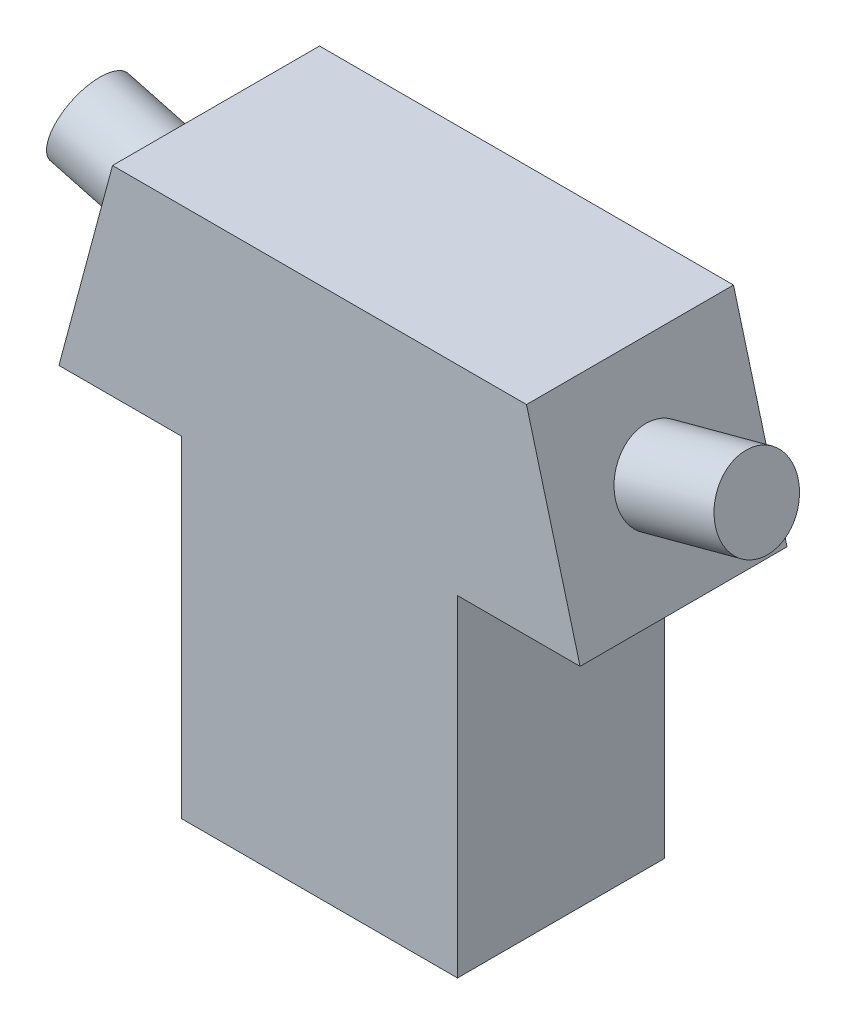
ISO-10303-21;
HEADER;
FILE_DESCRIPTION(('STEP AP214'),'2;1');
FILE_NAME('part.step','',(''),(''),'','','');
FILE_SCHEMA(('AUTOMOTIVE_DESIGN { 1 0 10303 214 1 1 1 1 }'));
ENDSEC;
DATA;
#1=APPLICATION_CONTEXT('core data for automotive mechanical design processes');
#2=APPLICATION_PROTOCOL_DEFINITION('international standard','automotive_design',2000,#1);
#3=PRODUCT_CONTEXT('',#1,'mechanical');
#4=PRODUCT('Part','Part','',(#3));
#5=PRODUCT_RELATED_PRODUCT_CATEGORY('part','',(#4));
#6=PRODUCT_DEFINITION_FORMATION('','',#4);
#7=PRODUCT_DEFINITION_CONTEXT('part definition',#1,'design');
#8=PRODUCT_DEFINITION('design','',#6,#7);
#9=PRODUCT_DEFINITION_SHAPE('','',#8);
#10=(LENGTH_UNIT() NAMED_UNIT(*) SI_UNIT(.MILLI.,.METRE.));
#11=(NAMED_UNIT(*) PLANE_ANGLE_UNIT() SI_UNIT($,.RADIAN.));
#12=(NAMED_UNIT(*) SI_UNIT($,.STERADIAN.) SOLID_ANGLE_UNIT());
#13=UNCERTAINTY_MEASURE_WITH_UNIT(LENGTH_MEASURE(1.E-05),#10,'distance_accuracy_value','');
#14=(GEOMETRIC_REPRESENTATION_CONTEXT(3) GLOBAL_UNCERTAINTY_ASSIGNED_CONTEXT((#13)) GLOBAL_UNIT_ASSIGNED_CONTEXT((#10,
#11,#12)) REPRESENTATION_CONTEXT('',''));
#15=CARTESIAN_POINT('',(0.,0.,0.));
#16=DIRECTION('',(0.,0.,1.));
#17=DIRECTION('',(1.,0.,0.));
#18=AXIS2_PLACEMENT_3D('',#15,#16,#17);
#19=CARTESIAN_POINT('',(100.,0.,150.));
#20=DIRECTION('',(-1.,0.,0.));
#21=DIRECTION('',(0.,0.,1.));
#22=AXIS2_PLACEMENT_3D('',#19,#20,#21);
#23=PLANE('',#22);
#24=DIRECTION('',(0.,1.,0.));
#25=VECTOR('',#24,1.);
#26=CARTESIAN_POINT('',(100.,0.,0.));
#27=LINE('',#26,#25);
#28=CARTESIAN_POINT('',(100.,0.,0.));
#29=VERTEX_POINT('',#28);
#30=CARTESIAN_POINT('',(100.,240.,0.));
#31=VERTEX_POINT('',#30);
#32=EDGE_CURVE('E133',#29,#31,#27,.T.);
#33=ORIENTED_EDGE('',*,*,#32,.T.);
#34=DIRECTION('',(0.,0.,-1.));
#35=VECTOR('',#34,1.);
#36=CARTESIAN_POINT('',(100.,240.,150.));
#37=LINE('',#36,#35);
#38=CARTESIAN_POINT('',(100.,240.,150.));
#39=VERTEX_POINT('',#38);
#40=EDGE_CURVE('E38',#39,#31,#37,.T.);
#41=ORIENTED_EDGE('',*,*,#40,.F.);
#42=DIRECTION('',(0.,1.,0.));
#43=VECTOR('',#42,1.);
#44=CARTESIAN_POINT('',(100.,0.,150.));
#45=LINE('',#44,#43);
#46=CARTESIAN_POINT('',(100.,0.,150.));
#47=VERTEX_POINT('',#46);
#48=EDGE_CURVE('E148',#47,#39,#45,.T.);
#49=ORIENTED_EDGE('',*,*,#48,.F.);
#50=DIRECTION('',(0.,0.,-1.));
#51=VECTOR('',#50,1.);
#52=CARTESIAN_POINT('',(100.,0.,150.));
#53=LINE('',#52,#51);
#54=EDGE_CURVE('E129',#47,#29,#53,.T.);
#55=ORIENTED_EDGE('',*,*,#54,.T.);
#56=EDGE_LOOP('',(#33,#41,#49,#55));
#57=FACE_BOUND('',#56,.T.);
#58=ADVANCED_FACE('F35',(#57),#23,.F.);
#59=CARTESIAN_POINT('',(100.,240.,150.));
#60=DIRECTION('',(0.,1.,0.));
#61=DIRECTION('',(0.,0.,1.));
#62=AXIS2_PLACEMENT_3D('',#59,#60,#61);
#63=PLANE('',#62);
#64=DIRECTION('',(1.,0.,0.));
#65=VECTOR('',#64,1.);
#66=CARTESIAN_POINT('',(100.,240.,0.));
#67=LINE('',#66,#65);
#68=CARTESIAN_POINT('',(188.822856765379,240.,0.));
#69=VERTEX_POINT('',#68);
#70=EDGE_CURVE('E136',#31,#69,#67,.T.);
#71=ORIENTED_EDGE('',*,*,#70,.T.);
#72=DIRECTION('',(0.,0.,-1.));
#73=VECTOR('',#72,1.);
#74=CARTESIAN_POINT('',(188.822856765379,240.,150.));
#75=LINE('',#74,#73);
#76=CARTESIAN_POINT('',(188.822856765379,240.,150.));
#77=VERTEX_POINT('',#76);
#78=EDGE_CURVE('E157',#77,#69,#75,.T.);
#79=ORIENTED_EDGE('',*,*,#78,.F.);
#80=DIRECTION('',(1.,0.,0.));
#81=VECTOR('',#80,1.);
#82=CARTESIAN_POINT('',(100.,240.,150.));
#83=LINE('',#82,#81);
#84=EDGE_CURVE('E96',#39,#77,#83,.T.);
#85=ORIENTED_EDGE('',*,*,#84,.F.);
#86=ORIENTED_EDGE('',*,*,#40,.T.);
#87=EDGE_LOOP('',(#71,#79,#85,#86));
#88=FACE_BOUND('',#87,.T.);
#89=ADVANCED_FACE('F163',(#88),#63,.F.);
#90=CARTESIAN_POINT('',(188.822856765379,240.,150.));
#91=DIRECTION('',(-0.965925826289067,-0.258819045102525,0.));
#92=DIRECTION('',(0.258819045102525,-0.965925826289067,0.));
#93=AXIS2_PLACEMENT_3D('',#90,#91,#92);
#94=PLANE('',#93);
#95=CARTESIAN_POINT('',(169.411428382689,312.44443697168,75.));
#96=DIRECTION('',(0.965925826289067,0.258819045102525,0.));
#97=DIRECTION('',(-0.258819045102525,0.965925826289067,0.));
#98=AXIS2_PLACEMENT_3D('',#95,#96,#97);
#99=CIRCLE('',#98,30.);
#100=CARTESIAN_POINT('',(161.646857029614,341.422211760352,75.));
#101=VERTEX_POINT('',#100);
#102=EDGE_CURVE('E11',#101,#101,#99,.T.);
#103=ORIENTED_EDGE('',*,*,#102,.F.);
#104=EDGE_LOOP('',(#103));
#105=FACE_BOUND('',#104,.T.);
#106=DIRECTION('',(-0.258819045102525,0.965925826289067,0.));
#107=VECTOR('',#106,1.);
#108=CARTESIAN_POINT('',(188.822856765379,240.,0.));
#109=LINE('',#108,#107);
#110=CARTESIAN_POINT('',(150.,384.88887394336,0.));
#111=VERTEX_POINT('',#110);
#112=EDGE_CURVE('E139',#69,#111,#109,.T.);
#113=ORIENTED_EDGE('',*,*,#112,.T.);
#114=DIRECTION('',(0.,0.,-1.));
#115=VECTOR('',#114,1.);
#116=CARTESIAN_POINT('',(150.,384.88887394336,150.));
#117=LINE('',#116,#115);
#118=CARTESIAN_POINT('',(150.,384.88887394336,150.));
#119=VERTEX_POINT('',#118);
#120=EDGE_CURVE('E155',#119,#111,#117,.T.);
#121=ORIENTED_EDGE('',*,*,#120,.F.);
#122=DIRECTION('',(-0.258819045102525,0.965925826289067,0.));
#123=VECTOR('',#122,1.);
#124=CARTESIAN_POINT('',(188.822856765379,240.,150.));
#125=LINE('',#124,#123);
#126=EDGE_CURVE('E178',#77,#119,#125,.T.);
#127=ORIENTED_EDGE('',*,*,#126,.F.);
#128=ORIENTED_EDGE('',*,*,#78,.T.);
#129=EDGE_LOOP('',(#113,#121,#127,#128));
#130=FACE_BOUND('',#129,.T.);
#131=ADVANCED_FACE('F172',(#105,#130),#94,.F.);
#132=CARTESIAN_POINT('',(150.,384.88887394336,150.));
#133=DIRECTION('',(0.,-1.,0.));
#134=DIRECTION('',(0.,0.,-1.));
#135=AXIS2_PLACEMENT_3D('',#132,#133,#134);
#136=PLANE('',#135);
#137=DIRECTION('',(-1.,0.,0.));
#138=VECTOR('',#137,1.);
#139=CARTESIAN_POINT('',(150.,384.88887394336,0.));
#140=LINE('',#139,#138);
#141=CARTESIAN_POINT('',(-150.,384.88887394336,0.));
#142=VERTEX_POINT('',#141);
#143=EDGE_CURVE('E141',#111,#142,#140,.T.);
#144=ORIENTED_EDGE('',*,*,#143,.T.);
#145=DIRECTION('',(0.,0.,-1.));
#146=VECTOR('',#145,1.);
#147=CARTESIAN_POINT('',(-150.,384.88887394336,150.));
#148=LINE('',#147,#146);
#149=CARTESIAN_POINT('',(-150.,384.88887394336,150.));
#150=VERTEX_POINT('',#149);
#151=EDGE_CURVE('E152',#150,#142,#148,.T.);
#152=ORIENTED_EDGE('',*,*,#151,.F.);
#153=DIRECTION('',(-1.,0.,0.));
#154=VECTOR('',#153,1.);
#155=CARTESIAN_POINT('',(150.,384.88887394336,150.));
#156=LINE('',#155,#154);
#157=EDGE_CURVE('E177',#119,#150,#156,.T.);
#158=ORIENTED_EDGE('',*,*,#157,.F.);
#159=ORIENTED_EDGE('',*,*,#120,.T.);
#160=EDGE_LOOP('',(#144,#152,#158,#159));
#161=FACE_BOUND('',#160,.T.);
#162=ADVANCED_FACE('F175',(#161),#136,.F.);
#163=CARTESIAN_POINT('',(-188.822856765379,240.,150.));
#164=DIRECTION('',(0.965925826289067,-0.258819045102525,0.));
#165=DIRECTION('',(0.258819045102525,0.965925826289067,0.));
#166=AXIS2_PLACEMENT_3D('',#163,#164,#165);
#167=PLANE('',#166);
#168=CARTESIAN_POINT('',(-169.411428382689,312.44443697168,75.));
#169=DIRECTION('',(0.965925826289067,-0.258819045102525,0.));
#170=DIRECTION('',(0.258819045102525,0.965925826289067,0.));
#171=AXIS2_PLACEMENT_3D('',#168,#169,#170);
#172=CIRCLE('',#171,30.);
#173=CARTESIAN_POINT('',(-161.646857029614,341.422211760352,75.));
#174=VERTEX_POINT('',#173);
#175=EDGE_CURVE('E187',#174,#174,#172,.T.);
#176=ORIENTED_EDGE('',*,*,#175,.T.);
#177=EDGE_LOOP('',(#176));
#178=FACE_BOUND('',#177,.T.);
#179=DIRECTION('',(-0.258819045102525,-0.965925826289067,0.));
#180=VECTOR('',#179,1.);
#181=CARTESIAN_POINT('',(-188.822856765379,240.,0.));
#182=LINE('',#181,#180);
#183=CARTESIAN_POINT('',(-188.822856765379,240.,0.));
#184=VERTEX_POINT('',#183);
#185=EDGE_CURVE('E143',#142,#184,#182,.T.);
#186=ORIENTED_EDGE('',*,*,#185,.T.);
#187=DIRECTION('',(0.,0.,-1.));
#188=VECTOR('',#187,1.);
#189=CARTESIAN_POINT('',(-188.822856765379,240.,150.));
#190=LINE('',#189,#188);
#191=CARTESIAN_POINT('',(-188.822856765379,240.,150.));
#192=VERTEX_POINT('',#191);
#193=EDGE_CURVE('E124',#192,#184,#190,.T.);
#194=ORIENTED_EDGE('',*,*,#193,.F.);
#195=DIRECTION('',(-0.258819045102525,-0.965925826289067,0.));
#196=VECTOR('',#195,1.);
#197=CARTESIAN_POINT('',(-188.822856765379,240.,150.));
#198=LINE('',#197,#196);
#199=EDGE_CURVE('E115',#150,#192,#198,.T.);
#200=ORIENTED_EDGE('',*,*,#199,.F.);
#201=ORIENTED_EDGE('',*,*,#151,.T.);
#202=EDGE_LOOP('',(#186,#194,#200,#201));
#203=FACE_BOUND('',#202,.T.);
#204=ADVANCED_FACE('F230',(#178,#203),#167,.F.);
#205=CARTESIAN_POINT('',(-100.,240.,150.));
#206=DIRECTION('',(0.,1.,0.));
#207=DIRECTION('',(0.,0.,1.));
#208=AXIS2_PLACEMENT_3D('',#205,#206,#207);
#209=PLANE('',#208);
#210=DIRECTION('',(1.,0.,0.));
#211=VECTOR('',#210,1.);
#212=CARTESIAN_POINT('',(-100.,240.,0.));
#213=LINE('',#212,#211);
#214=CARTESIAN_POINT('',(-100.,240.,0.));
#215=VERTEX_POINT('',#214);
#216=EDGE_CURVE('E123',#184,#215,#213,.T.);
#217=ORIENTED_EDGE('',*,*,#216,.T.);
#218=DIRECTION('',(0.,0.,-1.));
#219=VECTOR('',#218,1.);
#220=CARTESIAN_POINT('',(-100.,240.,150.));
#221=LINE('',#220,#219);
#222=CARTESIAN_POINT('',(-100.,240.,150.));
#223=VERTEX_POINT('',#222);
#224=EDGE_CURVE('E120',#223,#215,#221,.T.);
#225=ORIENTED_EDGE('',*,*,#224,.F.);
#226=DIRECTION('',(1.,0.,0.));
#227=VECTOR('',#226,1.);
#228=CARTESIAN_POINT('',(-100.,240.,150.));
#229=LINE('',#228,#227);
#230=EDGE_CURVE('E109',#192,#223,#229,.T.);
#231=ORIENTED_EDGE('',*,*,#230,.F.);
#232=ORIENTED_EDGE('',*,*,#193,.T.);
#233=EDGE_LOOP('',(#217,#225,#231,#232));
#234=FACE_BOUND('',#233,.T.);
#235=ADVANCED_FACE('F121',(#234),#209,.F.);
#236=CARTESIAN_POINT('',(-100.,0.,150.));
#237=DIRECTION('',(1.,0.,0.));
#238=DIRECTION('',(0.,0.,-1.));
#239=AXIS2_PLACEMENT_3D('',#236,#237,#238);
#240=PLANE('',#239);
#241=DIRECTION('',(0.,-1.,0.));
#242=VECTOR('',#241,1.);
#243=CARTESIAN_POINT('',(-100.,0.,0.));
#244=LINE('',#243,#242);
#245=CARTESIAN_POINT('',(-100.,0.,0.));
#246=VERTEX_POINT('',#245);
#247=EDGE_CURVE('E81',#215,#246,#244,.T.);
#248=ORIENTED_EDGE('',*,*,#247,.T.);
#249=DIRECTION('',(0.,0.,-1.));
#250=VECTOR('',#249,1.);
#251=CARTESIAN_POINT('',(-100.,0.,150.));
#252=LINE('',#251,#250);
#253=CARTESIAN_POINT('',(-100.,0.,150.));
#254=VERTEX_POINT('',#253);
#255=EDGE_CURVE('E125',#254,#246,#252,.T.);
#256=ORIENTED_EDGE('',*,*,#255,.F.);
#257=DIRECTION('',(0.,-1.,0.));
#258=VECTOR('',#257,1.);
#259=CARTESIAN_POINT('',(-100.,0.,150.));
#260=LINE('',#259,#258);
#261=EDGE_CURVE('E113',#223,#254,#260,.T.);
#262=ORIENTED_EDGE('',*,*,#261,.F.);
#263=ORIENTED_EDGE('',*,*,#224,.T.);
#264=EDGE_LOOP('',(#248,#256,#262,#263));
#265=FACE_BOUND('',#264,.T.);
#266=ADVANCED_FACE('F127',(#265),#240,.F.);
#267=CARTESIAN_POINT('',(-100.,0.,150.));
#268=DIRECTION('',(0.,1.,0.));
#269=DIRECTION('',(0.,0.,1.));
#270=AXIS2_PLACEMENT_3D('',#267,#268,#269);
#271=PLANE('',#270);
#272=CARTESIAN_POINT('',(0.,0.,75.));
#273=DIRECTION('',(0.,-1.,0.));
#274=DIRECTION('',(0.,0.,-1.));
#275=AXIS2_PLACEMENT_3D('',#272,#273,#274);
#276=CIRCLE('',#275,50.);
#277=CARTESIAN_POINT('',(0.,0.,25.));
#278=VERTEX_POINT('',#277);
#279=EDGE_CURVE('E193',#278,#278,#276,.T.);
#280=ORIENTED_EDGE('',*,*,#279,.F.);
#281=EDGE_LOOP('',(#280));
#282=FACE_BOUND('',#281,.T.);
#283=DIRECTION('',(1.,0.,0.));
#284=VECTOR('',#283,1.);
#285=CARTESIAN_POINT('',(-100.,0.,0.));
#286=LINE('',#285,#284);
#287=EDGE_CURVE('E87',#246,#29,#286,.T.);
#288=ORIENTED_EDGE('',*,*,#287,.T.);
#289=ORIENTED_EDGE('',*,*,#54,.F.);
#290=DIRECTION('',(1.,0.,0.));
#291=VECTOR('',#290,1.);
#292=CARTESIAN_POINT('',(-100.,0.,150.));
#293=LINE('',#292,#291);
#294=EDGE_CURVE('E52',#254,#47,#293,.T.);
#295=ORIENTED_EDGE('',*,*,#294,.F.);
#296=ORIENTED_EDGE('',*,*,#255,.T.);
#297=EDGE_LOOP('',(#288,#289,#295,#296));
#298=FACE_BOUND('',#297,.T.);
#299=ADVANCED_FACE('F208',(#282,#298),#271,.F.);
#300=CARTESIAN_POINT('',(0.,0.,150.));
#301=DIRECTION('',(0.,0.,-1.));
#302=DIRECTION('',(-1.,0.,0.));
#303=AXIS2_PLACEMENT_3D('',#300,#301,#302);
#304=PLANE('',#303);
#305=ORIENTED_EDGE('',*,*,#48,.T.);
#306=ORIENTED_EDGE('',*,*,#84,.T.);
#307=ORIENTED_EDGE('',*,*,#126,.T.);
#308=ORIENTED_EDGE('',*,*,#157,.T.);
#309=ORIENTED_EDGE('',*,*,#199,.T.);
#310=ORIENTED_EDGE('',*,*,#230,.T.);
#311=ORIENTED_EDGE('',*,*,#261,.T.);
#312=ORIENTED_EDGE('',*,*,#294,.T.);
#313=EDGE_LOOP('',(#305,#306,#307,#308,#309,#310,#311,#312));
#314=FACE_BOUND('',#313,.T.);
#315=ADVANCED_FACE('F111',(#314),#304,.F.);
#316=CARTESIAN_POINT('',(0.,0.,0.));
#317=DIRECTION('',(0.,0.,-1.));
#318=DIRECTION('',(-1.,0.,0.));
#319=AXIS2_PLACEMENT_3D('',#316,#317,#318);
#320=PLANE('',#319);
#321=ORIENTED_EDGE('',*,*,#32,.F.);
#322=ORIENTED_EDGE('',*,*,#287,.F.);
#323=ORIENTED_EDGE('',*,*,#247,.F.);
#324=ORIENTED_EDGE('',*,*,#216,.F.);
#325=ORIENTED_EDGE('',*,*,#185,.F.);
#326=ORIENTED_EDGE('',*,*,#143,.F.);
#327=ORIENTED_EDGE('',*,*,#112,.F.);
#328=ORIENTED_EDGE('',*,*,#70,.F.);
#329=EDGE_LOOP('',(#321,#322,#323,#324,#325,#326,#327,#328));
#330=FACE_BOUND('',#329,.T.);
#331=ADVANCED_FACE('F168',(#330),#320,.T.);
#332=CARTESIAN_POINT('',(241.855865354369,331.855865354369,75.));
#333=DIRECTION('',(-0.965925826289067,-0.258819045102525,0.));
#334=DIRECTION('',(0.258819045102525,-0.965925826289067,0.));
#335=AXIS2_PLACEMENT_3D('',#332,#333,#334);
#336=CYLINDRICAL_SURFACE('',#335,30.);
#337=CARTESIAN_POINT('',(241.855865354369,331.855865354369,75.));
#338=DIRECTION('',(0.965925826289067,0.258819045102525,0.));
#339=DIRECTION('',(-0.258819045102525,0.965925826289067,0.));
#340=AXIS2_PLACEMENT_3D('',#337,#338,#339);
#341=CIRCLE('',#340,30.);
#342=CARTESIAN_POINT('',(234.091294001294,360.833640143041,75.));
#343=VERTEX_POINT('',#342);
#344=EDGE_CURVE('E137',#343,#343,#341,.T.);
#345=ORIENTED_EDGE('',*,*,#344,.F.);
#346=EDGE_LOOP('',(#345));
#347=FACE_BOUND('',#346,.T.);
#348=ORIENTED_EDGE('',*,*,#102,.T.);
#349=EDGE_LOOP('',(#348));
#350=FACE_BOUND('',#349,.T.);
#351=ADVANCED_FACE('F260',(#347,#350),#336,.T.);
#352=CARTESIAN_POINT('',(241.855865354369,331.855865354369,75.));
#353=DIRECTION('',(0.965925826289067,0.258819045102525,0.));
#354=DIRECTION('',(-0.258819045102525,0.965925826289067,0.));
#355=AXIS2_PLACEMENT_3D('',#352,#353,#354);
#356=PLANE('',#355);
#357=ORIENTED_EDGE('',*,*,#344,.T.);
#358=EDGE_LOOP('',(#357));
#359=FACE_BOUND('',#358,.T.);
#360=ADVANCED_FACE('F276',(#359),#356,.T.);
#361=CARTESIAN_POINT('',(-241.855865354369,331.855865354369,75.));
#362=DIRECTION('',(0.965925826289067,-0.258819045102525,0.));
#363=DIRECTION('',(0.258819045102525,0.965925826289067,0.));
#364=AXIS2_PLACEMENT_3D('',#361,#362,#363);
#365=CYLINDRICAL_SURFACE('',#364,30.);
#366=CARTESIAN_POINT('',(-241.855865354369,331.855865354369,75.));
#367=DIRECTION('',(0.965925826289067,-0.258819045102525,0.));
#368=DIRECTION('',(0.258819045102525,0.965925826289067,0.));
#369=AXIS2_PLACEMENT_3D('',#366,#367,#368);
#370=CIRCLE('',#369,30.);
#371=CARTESIAN_POINT('',(-234.091294001294,360.833640143041,75.));
#372=VERTEX_POINT('',#371);
#373=EDGE_CURVE('E186',#372,#372,#370,.T.);
#374=ORIENTED_EDGE('',*,*,#373,.T.);
#375=EDGE_LOOP('',(#374));
#376=FACE_BOUND('',#375,.T.);
#377=ORIENTED_EDGE('',*,*,#175,.F.);
#378=EDGE_LOOP('',(#377));
#379=FACE_BOUND('',#378,.T.);
#380=ADVANCED_FACE('F285',(#376,#379),#365,.T.);
#381=CARTESIAN_POINT('',(-241.855865354369,331.855865354369,75.));
#382=DIRECTION('',(-0.965925826289067,0.258819045102525,0.));
#383=DIRECTION('',(0.258819045102525,0.965925826289067,0.));
#384=AXIS2_PLACEMENT_3D('',#381,#382,#383);
#385=PLANE('',#384);
#386=ORIENTED_EDGE('',*,*,#373,.F.);
#387=EDGE_LOOP('',(#386));
#388=FACE_BOUND('',#387,.T.);
#389=ADVANCED_FACE('F204',(#388),#385,.T.);
#390=CARTESIAN_POINT('',(0.,100.,75.));
#391=DIRECTION('',(0.,-1.,0.));
#392=DIRECTION('',(0.,0.,-1.));
#393=AXIS2_PLACEMENT_3D('',#390,#391,#392);
#394=CYLINDRICAL_SURFACE('',#393,50.);
#395=CARTESIAN_POINT('',(0.,100.,75.));
#396=DIRECTION('',(0.,-1.,0.));
#397=DIRECTION('',(0.,0.,-1.));
#398=AXIS2_PLACEMENT_3D('',#395,#396,#397);
#399=CIRCLE('',#398,50.);
#400=CARTESIAN_POINT('',(0.,100.,25.));
#401=VERTEX_POINT('',#400);
#402=EDGE_CURVE('E190',#401,#401,#399,.T.);
#403=ORIENTED_EDGE('',*,*,#402,.F.);
#404=EDGE_LOOP('',(#403));
#405=FACE_BOUND('',#404,.T.);
#406=ORIENTED_EDGE('',*,*,#279,.T.);
#407=EDGE_LOOP('',(#406));
#408=FACE_BOUND('',#407,.T.);
#409=ADVANCED_FACE('F201',(#405,#408),#394,.F.);
#410=CARTESIAN_POINT('',(0.,100.,75.));
#411=DIRECTION('',(0.,-1.,0.));
#412=DIRECTION('',(0.,0.,-1.));
#413=AXIS2_PLACEMENT_3D('',#410,#411,#412);
#414=PLANE('',#413);
#415=ORIENTED_EDGE('',*,*,#402,.T.);
#416=EDGE_LOOP('',(#415));
#417=FACE_BOUND('',#416,.T.);
#418=ADVANCED_FACE('F199',(#417),#414,.T.);
#419=CLOSED_SHELL('',(#58,#89,#131,#162,#204,#235,#266,#299,#315,#331,#351,#360,#380,#389,#409,#418));
#420=MANIFOLD_SOLID_BREP('B2',#419);
#421=ADVANCED_BREP_SHAPE_REPRESENTATION('',(#18,#420),#14);
#422=SHAPE_DEFINITION_REPRESENTATION(#9,#421);
ENDSEC;
END-ISO-10303-21;
